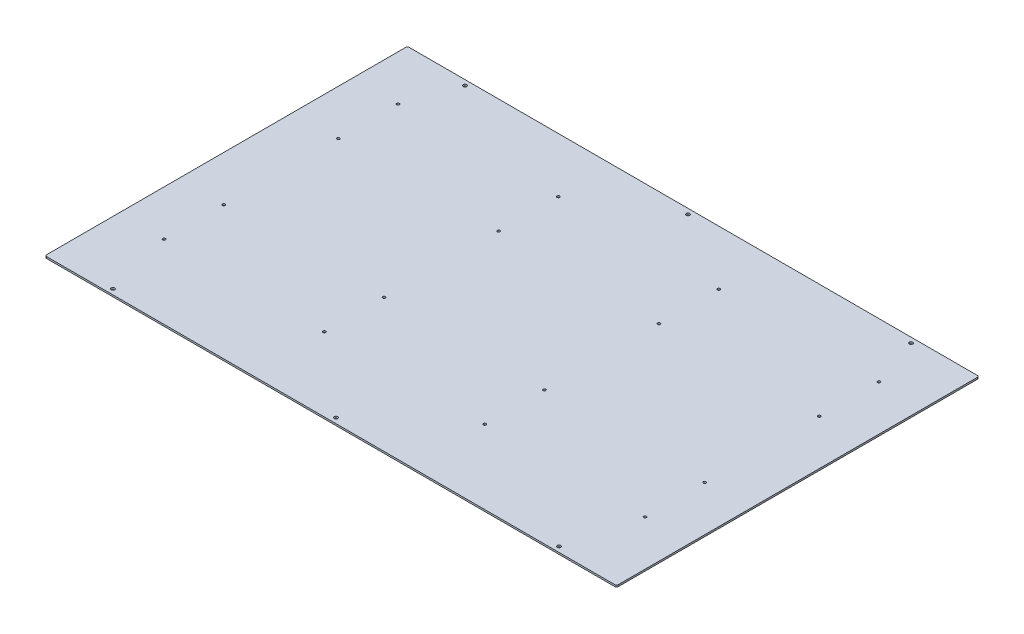
ISO-10303-21;
HEADER;
FILE_DESCRIPTION(('STEP AP214'),'2;1');
FILE_NAME('part.step','',(''),(''),'','','');
FILE_SCHEMA(('AUTOMOTIVE_DESIGN { 1 0 10303 214 1 1 1 1 }'));
ENDSEC;
DATA;
#1=APPLICATION_CONTEXT('core data for automotive mechanical design processes');
#2=APPLICATION_PROTOCOL_DEFINITION('international standard','automotive_design',2000,#1);
#3=PRODUCT_CONTEXT('',#1,'mechanical');
#4=PRODUCT('Part','Part','',(#3));
#5=PRODUCT_RELATED_PRODUCT_CATEGORY('part','',(#4));
#6=PRODUCT_DEFINITION_FORMATION('','',#4);
#7=PRODUCT_DEFINITION_CONTEXT('part definition',#1,'design');
#8=PRODUCT_DEFINITION('design','',#6,#7);
#9=PRODUCT_DEFINITION_SHAPE('','',#8);
#10=(LENGTH_UNIT() NAMED_UNIT(*) SI_UNIT(.MILLI.,.METRE.));
#11=(NAMED_UNIT(*) PLANE_ANGLE_UNIT() SI_UNIT($,.RADIAN.));
#12=(NAMED_UNIT(*) SI_UNIT($,.STERADIAN.) SOLID_ANGLE_UNIT());
#13=UNCERTAINTY_MEASURE_WITH_UNIT(LENGTH_MEASURE(1.E-05),#10,'distance_accuracy_value','');
#14=(GEOMETRIC_REPRESENTATION_CONTEXT(3) GLOBAL_UNCERTAINTY_ASSIGNED_CONTEXT((#13)) GLOBAL_UNIT_ASSIGNED_CONTEXT((#10,
#11,#12)) REPRESENTATION_CONTEXT('',''));
#15=CARTESIAN_POINT('',(0.,0.,0.));
#16=DIRECTION('',(0.,0.,1.));
#17=DIRECTION('',(1.,0.,0.));
#18=AXIS2_PLACEMENT_3D('',#15,#16,#17);
#19=CARTESIAN_POINT('',(-517.525,0.,327.025));
#20=DIRECTION('',(0.,-1.,0.));
#21=DIRECTION('',(0.,0.,-1.));
#22=AXIS2_PLACEMENT_3D('',#19,#20,#21);
#23=PLANE('',#22);
#24=CARTESIAN_POINT('',(-438.150000000001,0.,-230.468256121182));
#25=DIRECTION('',(0.,1.,0.));
#26=DIRECTION('',(0.,0.,1.));
#27=AXIS2_PLACEMENT_3D('',#24,#25,#26);
#28=CIRCLE('',#27,2.45744999999997);
#29=CARTESIAN_POINT('',(-438.150000000001,0.,-228.010806121182));
#30=VERTEX_POINT('',#29);
#31=EDGE_CURVE('E307',#30,#30,#28,.T.);
#32=ORIENTED_EDGE('',*,*,#31,.T.);
#33=EDGE_LOOP('',(#32));
#34=FACE_BOUND('',#33,.T.);
#35=CARTESIAN_POINT('',(-438.150000000001,0.,-121.756256121182));
#36=DIRECTION('',(0.,1.,0.));
#37=DIRECTION('',(0.,0.,1.));
#38=AXIS2_PLACEMENT_3D('',#35,#36,#37);
#39=CIRCLE('',#38,2.45744999999997);
#40=CARTESIAN_POINT('',(-438.150000000001,0.,-119.298806121182));
#41=VERTEX_POINT('',#40);
#42=EDGE_CURVE('E301',#41,#41,#39,.T.);
#43=ORIENTED_EDGE('',*,*,#42,.T.);
#44=EDGE_LOOP('',(#43));
#45=FACE_BOUND('',#44,.T.);
#46=CARTESIAN_POINT('',(-146.050000000002,0.,-121.756256121182));
#47=DIRECTION('',(0.,1.,0.));
#48=DIRECTION('',(0.,0.,1.));
#49=AXIS2_PLACEMENT_3D('',#46,#47,#48);
#50=CIRCLE('',#49,2.45745);
#51=CARTESIAN_POINT('',(-146.050000000002,0.,-119.298806121182));
#52=VERTEX_POINT('',#51);
#53=EDGE_CURVE('E295',#52,#52,#50,.T.);
#54=ORIENTED_EDGE('',*,*,#53,.T.);
#55=EDGE_LOOP('',(#54));
#56=FACE_BOUND('',#55,.T.);
#57=CARTESIAN_POINT('',(-517.525,0.,327.025));
#58=DIRECTION('',(0.,1.,0.));
#59=DIRECTION('',(0.,0.,-1.));
#60=AXIS2_PLACEMENT_3D('',#57,#58,#59);
#61=CIRCLE('',#60,3.17500000000001);
#62=CARTESIAN_POINT('',(-520.7,0.,327.025));
#63=VERTEX_POINT('',#62);
#64=CARTESIAN_POINT('',(-517.525,0.,330.2));
#65=VERTEX_POINT('',#64);
#66=EDGE_CURVE('E134',#63,#65,#61,.T.);
#67=ORIENTED_EDGE('',*,*,#66,.F.);
#68=DIRECTION('',(0.,0.,1.));
#69=VECTOR('',#68,1.);
#70=CARTESIAN_POINT('',(-520.7,0.,327.025));
#71=LINE('',#70,#69);
#72=CARTESIAN_POINT('',(-520.7,0.,-327.025));
#73=VERTEX_POINT('',#72);
#74=EDGE_CURVE('E88',#73,#63,#71,.T.);
#75=ORIENTED_EDGE('',*,*,#74,.F.);
#76=CARTESIAN_POINT('',(-517.525,0.,-327.025));
#77=DIRECTION('',(0.,1.,0.));
#78=DIRECTION('',(0.,0.,-1.));
#79=AXIS2_PLACEMENT_3D('',#76,#77,#78);
#80=CIRCLE('',#79,3.17500000000001);
#81=CARTESIAN_POINT('',(-517.525,0.,-330.2));
#82=VERTEX_POINT('',#81);
#83=EDGE_CURVE('E82',#82,#73,#80,.T.);
#84=ORIENTED_EDGE('',*,*,#83,.F.);
#85=DIRECTION('',(-1.,0.,0.));
#86=VECTOR('',#85,1.);
#87=CARTESIAN_POINT('',(-517.525,0.,-330.2));
#88=LINE('',#87,#86);
#89=CARTESIAN_POINT('',(517.525,0.,-330.2));
#90=VERTEX_POINT('',#89);
#91=EDGE_CURVE('E124',#90,#82,#88,.T.);
#92=ORIENTED_EDGE('',*,*,#91,.F.);
#93=CARTESIAN_POINT('',(517.525,0.,-327.025));
#94=DIRECTION('',(0.,1.,0.));
#95=DIRECTION('',(0.,0.,-1.));
#96=AXIS2_PLACEMENT_3D('',#93,#94,#95);
#97=CIRCLE('',#96,3.17500000000001);
#98=CARTESIAN_POINT('',(520.7,0.,-327.025));
#99=VERTEX_POINT('',#98);
#100=EDGE_CURVE('E144',#99,#90,#97,.T.);
#101=ORIENTED_EDGE('',*,*,#100,.F.);
#102=DIRECTION('',(0.,0.,-1.));
#103=VECTOR('',#102,1.);
#104=CARTESIAN_POINT('',(520.7,0.,327.025));
#105=LINE('',#104,#103);
#106=CARTESIAN_POINT('',(520.7,0.,327.025));
#107=VERTEX_POINT('',#106);
#108=EDGE_CURVE('E142',#107,#99,#105,.T.);
#109=ORIENTED_EDGE('',*,*,#108,.F.);
#110=CARTESIAN_POINT('',(517.525,0.,327.025));
#111=DIRECTION('',(0.,1.,0.));
#112=DIRECTION('',(0.,0.,1.));
#113=AXIS2_PLACEMENT_3D('',#110,#111,#112);
#114=CIRCLE('',#113,3.17500000000001);
#115=CARTESIAN_POINT('',(517.525,0.,330.2));
#116=VERTEX_POINT('',#115);
#117=EDGE_CURVE('E140',#116,#107,#114,.T.);
#118=ORIENTED_EDGE('',*,*,#117,.F.);
#119=DIRECTION('',(1.,0.,0.));
#120=VECTOR('',#119,1.);
#121=CARTESIAN_POINT('',(-517.525,0.,330.2));
#122=LINE('',#121,#120);
#123=EDGE_CURVE('E137',#65,#116,#122,.T.);
#124=ORIENTED_EDGE('',*,*,#123,.F.);
#125=EDGE_LOOP('',(#67,#75,#84,#92,#101,#109,#118,#124));
#126=FACE_BOUND('',#125,.T.);
#127=CARTESIAN_POINT('',(-406.4,0.,320.675));
#128=DIRECTION('',(0.,1.,0.));
#129=DIRECTION('',(0.,0.,1.));
#130=AXIS2_PLACEMENT_3D('',#127,#128,#129);
#131=CIRCLE('',#130,3.17499999999998);
#132=CARTESIAN_POINT('',(-406.4,0.,323.85));
#133=VERTEX_POINT('',#132);
#134=EDGE_CURVE('E138',#133,#133,#131,.T.);
#135=ORIENTED_EDGE('',*,*,#134,.T.);
#136=EDGE_LOOP('',(#135));
#137=FACE_BOUND('',#136,.T.);
#138=CARTESIAN_POINT('',(0.,0.,320.675));
#139=DIRECTION('',(0.,1.,0.));
#140=DIRECTION('',(0.,0.,1.));
#141=AXIS2_PLACEMENT_3D('',#138,#139,#140);
#142=CIRCLE('',#141,3.175);
#143=CARTESIAN_POINT('',(0.,0.,323.85));
#144=VERTEX_POINT('',#143);
#145=EDGE_CURVE('E187',#144,#144,#142,.T.);
#146=ORIENTED_EDGE('',*,*,#145,.T.);
#147=EDGE_LOOP('',(#146));
#148=FACE_BOUND('',#147,.T.);
#149=CARTESIAN_POINT('',(406.4,0.,320.675));
#150=DIRECTION('',(0.,1.,0.));
#151=DIRECTION('',(0.,0.,1.));
#152=AXIS2_PLACEMENT_3D('',#149,#150,#151);
#153=CIRCLE('',#152,3.17499999999998);
#154=CARTESIAN_POINT('',(406.4,0.,323.85));
#155=VERTEX_POINT('',#154);
#156=EDGE_CURVE('E193',#155,#155,#153,.T.);
#157=ORIENTED_EDGE('',*,*,#156,.T.);
#158=EDGE_LOOP('',(#157));
#159=FACE_BOUND('',#158,.T.);
#160=CARTESIAN_POINT('',(406.4,0.,-320.675));
#161=DIRECTION('',(0.,1.,0.));
#162=DIRECTION('',(0.,0.,1.));
#163=AXIS2_PLACEMENT_3D('',#160,#161,#162);
#164=CIRCLE('',#163,3.17499999999998);
#165=CARTESIAN_POINT('',(406.4,0.,-317.5));
#166=VERTEX_POINT('',#165);
#167=EDGE_CURVE('E199',#166,#166,#164,.T.);
#168=ORIENTED_EDGE('',*,*,#167,.T.);
#169=EDGE_LOOP('',(#168));
#170=FACE_BOUND('',#169,.T.);
#171=CARTESIAN_POINT('',(0.,0.,-320.675));
#172=DIRECTION('',(0.,1.,0.));
#173=DIRECTION('',(0.,0.,1.));
#174=AXIS2_PLACEMENT_3D('',#171,#172,#173);
#175=CIRCLE('',#174,3.175);
#176=CARTESIAN_POINT('',(0.,0.,-317.5));
#177=VERTEX_POINT('',#176);
#178=EDGE_CURVE('E205',#177,#177,#175,.T.);
#179=ORIENTED_EDGE('',*,*,#178,.T.);
#180=EDGE_LOOP('',(#179));
#181=FACE_BOUND('',#180,.T.);
#182=CARTESIAN_POINT('',(-406.4,0.,-320.675));
#183=DIRECTION('',(0.,1.,0.));
#184=DIRECTION('',(0.,0.,1.));
#185=AXIS2_PLACEMENT_3D('',#182,#183,#184);
#186=CIRCLE('',#185,3.17499999999998);
#187=CARTESIAN_POINT('',(-406.4,0.,-317.5));
#188=VERTEX_POINT('',#187);
#189=EDGE_CURVE('E211',#188,#188,#186,.T.);
#190=ORIENTED_EDGE('',*,*,#189,.T.);
#191=EDGE_LOOP('',(#190));
#192=FACE_BOUND('',#191,.T.);
#193=CARTESIAN_POINT('',(438.15,0.,195.743743878826));
#194=DIRECTION('',(0.,1.,0.));
#195=DIRECTION('',(0.,0.,1.));
#196=AXIS2_PLACEMENT_3D('',#193,#194,#195);
#197=CIRCLE('',#196,2.45744999999997);
#198=CARTESIAN_POINT('',(438.15,0.,198.201193878826));
#199=VERTEX_POINT('',#198);
#200=EDGE_CURVE('E217',#199,#199,#197,.T.);
#201=ORIENTED_EDGE('',*,*,#200,.T.);
#202=EDGE_LOOP('',(#201));
#203=FACE_BOUND('',#202,.T.);
#204=CARTESIAN_POINT('',(438.15,0.,87.0317438788256));
#205=DIRECTION('',(0.,1.,0.));
#206=DIRECTION('',(0.,0.,1.));
#207=AXIS2_PLACEMENT_3D('',#204,#205,#206);
#208=CIRCLE('',#207,2.45744999999997);
#209=CARTESIAN_POINT('',(438.15,0.,89.4891938788255));
#210=VERTEX_POINT('',#209);
#211=EDGE_CURVE('E223',#210,#210,#208,.T.);
#212=ORIENTED_EDGE('',*,*,#211,.T.);
#213=EDGE_LOOP('',(#212));
#214=FACE_BOUND('',#213,.T.);
#215=CARTESIAN_POINT('',(146.05,0.,195.743743878826));
#216=DIRECTION('',(0.,1.,0.));
#217=DIRECTION('',(0.,0.,1.));
#218=AXIS2_PLACEMENT_3D('',#215,#216,#217);
#219=CIRCLE('',#218,2.45745);
#220=CARTESIAN_POINT('',(146.05,0.,198.201193878826));
#221=VERTEX_POINT('',#220);
#222=EDGE_CURVE('E229',#221,#221,#219,.T.);
#223=ORIENTED_EDGE('',*,*,#222,.T.);
#224=EDGE_LOOP('',(#223));
#225=FACE_BOUND('',#224,.T.);
#226=CARTESIAN_POINT('',(146.05,0.,87.0317438788256));
#227=DIRECTION('',(0.,1.,0.));
#228=DIRECTION('',(0.,0.,1.));
#229=AXIS2_PLACEMENT_3D('',#226,#227,#228);
#230=CIRCLE('',#229,2.45745);
#231=CARTESIAN_POINT('',(146.05,0.,89.4891938788255));
#232=VERTEX_POINT('',#231);
#233=EDGE_CURVE('E235',#232,#232,#230,.T.);
#234=ORIENTED_EDGE('',*,*,#233,.T.);
#235=EDGE_LOOP('',(#234));
#236=FACE_BOUND('',#235,.T.);
#237=CARTESIAN_POINT('',(-146.05,0.,87.0317438788256));
#238=DIRECTION('',(0.,1.,0.));
#239=DIRECTION('',(0.,0.,1.));
#240=AXIS2_PLACEMENT_3D('',#237,#238,#239);
#241=CIRCLE('',#240,2.45745);
#242=CARTESIAN_POINT('',(-146.05,0.,89.4891938788256));
#243=VERTEX_POINT('',#242);
#244=EDGE_CURVE('E241',#243,#243,#241,.T.);
#245=ORIENTED_EDGE('',*,*,#244,.T.);
#246=EDGE_LOOP('',(#245));
#247=FACE_BOUND('',#246,.T.);
#248=CARTESIAN_POINT('',(-146.05,0.,195.743743878826));
#249=DIRECTION('',(0.,1.,0.));
#250=DIRECTION('',(0.,0.,1.));
#251=AXIS2_PLACEMENT_3D('',#248,#249,#250);
#252=CIRCLE('',#251,2.45745);
#253=CARTESIAN_POINT('',(-146.05,0.,198.201193878826));
#254=VERTEX_POINT('',#253);
#255=EDGE_CURVE('E247',#254,#254,#252,.T.);
#256=ORIENTED_EDGE('',*,*,#255,.T.);
#257=EDGE_LOOP('',(#256));
#258=FACE_BOUND('',#257,.T.);
#259=CARTESIAN_POINT('',(-438.15,0.,195.743743878826));
#260=DIRECTION('',(0.,1.,0.));
#261=DIRECTION('',(0.,0.,1.));
#262=AXIS2_PLACEMENT_3D('',#259,#260,#261);
#263=CIRCLE('',#262,2.45744999999997);
#264=CARTESIAN_POINT('',(-438.15,0.,198.201193878826));
#265=VERTEX_POINT('',#264);
#266=EDGE_CURVE('E253',#265,#265,#263,.T.);
#267=ORIENTED_EDGE('',*,*,#266,.T.);
#268=EDGE_LOOP('',(#267));
#269=FACE_BOUND('',#268,.T.);
#270=CARTESIAN_POINT('',(-438.15,0.,87.0317438788256));
#271=DIRECTION('',(0.,1.,0.));
#272=DIRECTION('',(0.,0.,1.));
#273=AXIS2_PLACEMENT_3D('',#270,#271,#272);
#274=CIRCLE('',#273,2.45744999999997);
#275=CARTESIAN_POINT('',(-438.15,0.,89.4891938788255));
#276=VERTEX_POINT('',#275);
#277=EDGE_CURVE('E259',#276,#276,#274,.T.);
#278=ORIENTED_EDGE('',*,*,#277,.T.);
#279=EDGE_LOOP('',(#278));
#280=FACE_BOUND('',#279,.T.);
#281=CARTESIAN_POINT('',(438.149999999998,0.,-121.756256121182));
#282=DIRECTION('',(0.,1.,0.));
#283=DIRECTION('',(0.,0.,1.));
#284=AXIS2_PLACEMENT_3D('',#281,#282,#283);
#285=CIRCLE('',#284,2.45744999999997);
#286=CARTESIAN_POINT('',(438.149999999998,0.,-119.298806121182));
#287=VERTEX_POINT('',#286);
#288=EDGE_CURVE('E265',#287,#287,#285,.T.);
#289=ORIENTED_EDGE('',*,*,#288,.T.);
#290=EDGE_LOOP('',(#289));
#291=FACE_BOUND('',#290,.T.);
#292=CARTESIAN_POINT('',(438.149999999998,0.,-230.468256121182));
#293=DIRECTION('',(0.,1.,0.));
#294=DIRECTION('',(0.,0.,1.));
#295=AXIS2_PLACEMENT_3D('',#292,#293,#294);
#296=CIRCLE('',#295,2.45744999999997);
#297=CARTESIAN_POINT('',(438.149999999998,0.,-228.010806121182));
#298=VERTEX_POINT('',#297);
#299=EDGE_CURVE('E271',#298,#298,#296,.T.);
#300=ORIENTED_EDGE('',*,*,#299,.T.);
#301=EDGE_LOOP('',(#300));
#302=FACE_BOUND('',#301,.T.);
#303=CARTESIAN_POINT('',(146.049999999998,0.,-230.468256121182));
#304=DIRECTION('',(0.,1.,0.));
#305=DIRECTION('',(0.,0.,1.));
#306=AXIS2_PLACEMENT_3D('',#303,#304,#305);
#307=CIRCLE('',#306,2.45745);
#308=CARTESIAN_POINT('',(146.049999999998,0.,-228.010806121182));
#309=VERTEX_POINT('',#308);
#310=EDGE_CURVE('E277',#309,#309,#307,.T.);
#311=ORIENTED_EDGE('',*,*,#310,.T.);
#312=EDGE_LOOP('',(#311));
#313=FACE_BOUND('',#312,.T.);
#314=CARTESIAN_POINT('',(146.049999999998,0.,-121.756256121182));
#315=DIRECTION('',(0.,1.,0.));
#316=DIRECTION('',(0.,0.,1.));
#317=AXIS2_PLACEMENT_3D('',#314,#315,#316);
#318=CIRCLE('',#317,2.45745);
#319=CARTESIAN_POINT('',(146.049999999998,0.,-119.298806121182));
#320=VERTEX_POINT('',#319);
#321=EDGE_CURVE('E283',#320,#320,#318,.T.);
#322=ORIENTED_EDGE('',*,*,#321,.T.);
#323=EDGE_LOOP('',(#322));
#324=FACE_BOUND('',#323,.T.);
#325=CARTESIAN_POINT('',(-146.050000000002,0.,-230.468256121182));
#326=DIRECTION('',(0.,1.,0.));
#327=DIRECTION('',(0.,0.,1.));
#328=AXIS2_PLACEMENT_3D('',#325,#326,#327);
#329=CIRCLE('',#328,2.45745);
#330=CARTESIAN_POINT('',(-146.050000000002,0.,-228.010806121182));
#331=VERTEX_POINT('',#330);
#332=EDGE_CURVE('E289',#331,#331,#329,.T.);
#333=ORIENTED_EDGE('',*,*,#332,.T.);
#334=EDGE_LOOP('',(#333));
#335=FACE_BOUND('',#334,.T.);
#336=ADVANCED_FACE('F36',(#34,#45,#56,#126,#137,#148,#159,#170,#181,#192,#203,#214,#225,#236,
#247,#258,#269,#280,#291,#302,#313,#324,#335),#23,.T.);
#337=CARTESIAN_POINT('',(-517.525,3.175,327.025));
#338=DIRECTION('',(0.,-1.,0.));
#339=DIRECTION('',(0.,0.,-1.));
#340=AXIS2_PLACEMENT_3D('',#337,#338,#339);
#341=PLANE('',#340);
#342=CARTESIAN_POINT('',(-438.150000000001,3.175,-230.468256121182));
#343=DIRECTION('',(0.,1.,0.));
#344=DIRECTION('',(0.,0.,1.));
#345=AXIS2_PLACEMENT_3D('',#342,#343,#344);
#346=CIRCLE('',#345,2.45744999999997);
#347=CARTESIAN_POINT('',(-438.150000000001,3.175,-228.010806121182));
#348=VERTEX_POINT('',#347);
#349=EDGE_CURVE('E310',#348,#348,#346,.T.);
#350=ORIENTED_EDGE('',*,*,#349,.F.);
#351=EDGE_LOOP('',(#350));
#352=FACE_BOUND('',#351,.T.);
#353=CARTESIAN_POINT('',(-438.150000000001,3.175,-121.756256121182));
#354=DIRECTION('',(0.,1.,0.));
#355=DIRECTION('',(0.,0.,1.));
#356=AXIS2_PLACEMENT_3D('',#353,#354,#355);
#357=CIRCLE('',#356,2.45744999999997);
#358=CARTESIAN_POINT('',(-438.150000000001,3.175,-119.298806121182));
#359=VERTEX_POINT('',#358);
#360=EDGE_CURVE('E304',#359,#359,#357,.T.);
#361=ORIENTED_EDGE('',*,*,#360,.F.);
#362=EDGE_LOOP('',(#361));
#363=FACE_BOUND('',#362,.T.);
#364=CARTESIAN_POINT('',(-146.050000000002,3.175,-121.756256121182));
#365=DIRECTION('',(0.,1.,0.));
#366=DIRECTION('',(0.,0.,1.));
#367=AXIS2_PLACEMENT_3D('',#364,#365,#366);
#368=CIRCLE('',#367,2.45745);
#369=CARTESIAN_POINT('',(-146.050000000002,3.175,-119.298806121182));
#370=VERTEX_POINT('',#369);
#371=EDGE_CURVE('E298',#370,#370,#368,.T.);
#372=ORIENTED_EDGE('',*,*,#371,.F.);
#373=EDGE_LOOP('',(#372));
#374=FACE_BOUND('',#373,.T.);
#375=CARTESIAN_POINT('',(-146.050000000002,3.175,-230.468256121182));
#376=DIRECTION('',(0.,1.,0.));
#377=DIRECTION('',(0.,0.,1.));
#378=AXIS2_PLACEMENT_3D('',#375,#376,#377);
#379=CIRCLE('',#378,2.45745);
#380=CARTESIAN_POINT('',(-146.050000000002,3.175,-228.010806121182));
#381=VERTEX_POINT('',#380);
#382=EDGE_CURVE('E292',#381,#381,#379,.T.);
#383=ORIENTED_EDGE('',*,*,#382,.F.);
#384=EDGE_LOOP('',(#383));
#385=FACE_BOUND('',#384,.T.);
#386=CARTESIAN_POINT('',(146.049999999998,3.175,-121.756256121182));
#387=DIRECTION('',(0.,1.,0.));
#388=DIRECTION('',(0.,0.,1.));
#389=AXIS2_PLACEMENT_3D('',#386,#387,#388);
#390=CIRCLE('',#389,2.45745);
#391=CARTESIAN_POINT('',(146.049999999998,3.175,-119.298806121182));
#392=VERTEX_POINT('',#391);
#393=EDGE_CURVE('E286',#392,#392,#390,.T.);
#394=ORIENTED_EDGE('',*,*,#393,.F.);
#395=EDGE_LOOP('',(#394));
#396=FACE_BOUND('',#395,.T.);
#397=CARTESIAN_POINT('',(146.049999999998,3.175,-230.468256121182));
#398=DIRECTION('',(0.,1.,0.));
#399=DIRECTION('',(0.,0.,1.));
#400=AXIS2_PLACEMENT_3D('',#397,#398,#399);
#401=CIRCLE('',#400,2.45745);
#402=CARTESIAN_POINT('',(146.049999999998,3.175,-228.010806121182));
#403=VERTEX_POINT('',#402);
#404=EDGE_CURVE('E280',#403,#403,#401,.T.);
#405=ORIENTED_EDGE('',*,*,#404,.F.);
#406=EDGE_LOOP('',(#405));
#407=FACE_BOUND('',#406,.T.);
#408=CARTESIAN_POINT('',(438.149999999998,3.175,-230.468256121182));
#409=DIRECTION('',(0.,1.,0.));
#410=DIRECTION('',(0.,0.,1.));
#411=AXIS2_PLACEMENT_3D('',#408,#409,#410);
#412=CIRCLE('',#411,2.45744999999997);
#413=CARTESIAN_POINT('',(438.149999999998,3.175,-228.010806121182));
#414=VERTEX_POINT('',#413);
#415=EDGE_CURVE('E274',#414,#414,#412,.T.);
#416=ORIENTED_EDGE('',*,*,#415,.F.);
#417=EDGE_LOOP('',(#416));
#418=FACE_BOUND('',#417,.T.);
#419=CARTESIAN_POINT('',(-438.15,3.175,87.0317438788256));
#420=DIRECTION('',(0.,1.,0.));
#421=DIRECTION('',(0.,0.,1.));
#422=AXIS2_PLACEMENT_3D('',#419,#420,#421);
#423=CIRCLE('',#422,2.45744999999997);
#424=CARTESIAN_POINT('',(-438.15,3.175,89.4891938788255));
#425=VERTEX_POINT('',#424);
#426=EDGE_CURVE('E262',#425,#425,#423,.T.);
#427=ORIENTED_EDGE('',*,*,#426,.F.);
#428=EDGE_LOOP('',(#427));
#429=FACE_BOUND('',#428,.T.);
#430=CARTESIAN_POINT('',(-438.15,3.175,195.743743878826));
#431=DIRECTION('',(0.,1.,0.));
#432=DIRECTION('',(0.,0.,1.));
#433=AXIS2_PLACEMENT_3D('',#430,#431,#432);
#434=CIRCLE('',#433,2.45744999999997);
#435=CARTESIAN_POINT('',(-438.15,3.175,198.201193878826));
#436=VERTEX_POINT('',#435);
#437=EDGE_CURVE('E256',#436,#436,#434,.T.);
#438=ORIENTED_EDGE('',*,*,#437,.F.);
#439=EDGE_LOOP('',(#438));
#440=FACE_BOUND('',#439,.T.);
#441=CARTESIAN_POINT('',(-146.05,3.175,195.743743878826));
#442=DIRECTION('',(0.,1.,0.));
#443=DIRECTION('',(0.,0.,1.));
#444=AXIS2_PLACEMENT_3D('',#441,#442,#443);
#445=CIRCLE('',#444,2.45745);
#446=CARTESIAN_POINT('',(-146.05,3.175,198.201193878826));
#447=VERTEX_POINT('',#446);
#448=EDGE_CURVE('E250',#447,#447,#445,.T.);
#449=ORIENTED_EDGE('',*,*,#448,.F.);
#450=EDGE_LOOP('',(#449));
#451=FACE_BOUND('',#450,.T.);
#452=CARTESIAN_POINT('',(-146.05,3.175,87.0317438788256));
#453=DIRECTION('',(0.,1.,0.));
#454=DIRECTION('',(0.,0.,1.));
#455=AXIS2_PLACEMENT_3D('',#452,#453,#454);
#456=CIRCLE('',#455,2.45745);
#457=CARTESIAN_POINT('',(-146.05,3.175,89.4891938788256));
#458=VERTEX_POINT('',#457);
#459=EDGE_CURVE('E244',#458,#458,#456,.T.);
#460=ORIENTED_EDGE('',*,*,#459,.F.);
#461=EDGE_LOOP('',(#460));
#462=FACE_BOUND('',#461,.T.);
#463=CARTESIAN_POINT('',(146.05,3.175,87.0317438788256));
#464=DIRECTION('',(0.,1.,0.));
#465=DIRECTION('',(0.,0.,1.));
#466=AXIS2_PLACEMENT_3D('',#463,#464,#465);
#467=CIRCLE('',#466,2.45745);
#468=CARTESIAN_POINT('',(146.05,3.175,89.4891938788255));
#469=VERTEX_POINT('',#468);
#470=EDGE_CURVE('E238',#469,#469,#467,.T.);
#471=ORIENTED_EDGE('',*,*,#470,.F.);
#472=EDGE_LOOP('',(#471));
#473=FACE_BOUND('',#472,.T.);
#474=CARTESIAN_POINT('',(146.05,3.175,195.743743878826));
#475=DIRECTION('',(0.,1.,0.));
#476=DIRECTION('',(0.,0.,1.));
#477=AXIS2_PLACEMENT_3D('',#474,#475,#476);
#478=CIRCLE('',#477,2.45745);
#479=CARTESIAN_POINT('',(146.05,3.175,198.201193878826));
#480=VERTEX_POINT('',#479);
#481=EDGE_CURVE('E232',#480,#480,#478,.T.);
#482=ORIENTED_EDGE('',*,*,#481,.F.);
#483=EDGE_LOOP('',(#482));
#484=FACE_BOUND('',#483,.T.);
#485=CARTESIAN_POINT('',(438.15,3.175,87.0317438788256));
#486=DIRECTION('',(0.,1.,0.));
#487=DIRECTION('',(0.,0.,1.));
#488=AXIS2_PLACEMENT_3D('',#485,#486,#487);
#489=CIRCLE('',#488,2.45744999999997);
#490=CARTESIAN_POINT('',(438.15,3.175,89.4891938788255));
#491=VERTEX_POINT('',#490);
#492=EDGE_CURVE('E226',#491,#491,#489,.T.);
#493=ORIENTED_EDGE('',*,*,#492,.F.);
#494=EDGE_LOOP('',(#493));
#495=FACE_BOUND('',#494,.T.);
#496=CARTESIAN_POINT('',(438.15,3.175,195.743743878826));
#497=DIRECTION('',(0.,1.,0.));
#498=DIRECTION('',(0.,0.,1.));
#499=AXIS2_PLACEMENT_3D('',#496,#497,#498);
#500=CIRCLE('',#499,2.45744999999997);
#501=CARTESIAN_POINT('',(438.15,3.175,198.201193878826));
#502=VERTEX_POINT('',#501);
#503=EDGE_CURVE('E220',#502,#502,#500,.T.);
#504=ORIENTED_EDGE('',*,*,#503,.F.);
#505=EDGE_LOOP('',(#504));
#506=FACE_BOUND('',#505,.T.);
#507=CARTESIAN_POINT('',(-406.4,3.175,-320.675));
#508=DIRECTION('',(0.,1.,0.));
#509=DIRECTION('',(0.,0.,1.));
#510=AXIS2_PLACEMENT_3D('',#507,#508,#509);
#511=CIRCLE('',#510,3.17499999999998);
#512=CARTESIAN_POINT('',(-406.4,3.175,-317.5));
#513=VERTEX_POINT('',#512);
#514=EDGE_CURVE('E214',#513,#513,#511,.T.);
#515=ORIENTED_EDGE('',*,*,#514,.F.);
#516=EDGE_LOOP('',(#515));
#517=FACE_BOUND('',#516,.T.);
#518=CARTESIAN_POINT('',(0.,3.175,-320.675));
#519=DIRECTION('',(0.,1.,0.));
#520=DIRECTION('',(0.,0.,1.));
#521=AXIS2_PLACEMENT_3D('',#518,#519,#520);
#522=CIRCLE('',#521,3.175);
#523=CARTESIAN_POINT('',(0.,3.175,-317.5));
#524=VERTEX_POINT('',#523);
#525=EDGE_CURVE('E208',#524,#524,#522,.T.);
#526=ORIENTED_EDGE('',*,*,#525,.F.);
#527=EDGE_LOOP('',(#526));
#528=FACE_BOUND('',#527,.T.);
#529=CARTESIAN_POINT('',(406.4,3.175,-320.675));
#530=DIRECTION('',(0.,1.,0.));
#531=DIRECTION('',(0.,0.,1.));
#532=AXIS2_PLACEMENT_3D('',#529,#530,#531);
#533=CIRCLE('',#532,3.17499999999998);
#534=CARTESIAN_POINT('',(406.4,3.175,-317.5));
#535=VERTEX_POINT('',#534);
#536=EDGE_CURVE('E202',#535,#535,#533,.T.);
#537=ORIENTED_EDGE('',*,*,#536,.F.);
#538=EDGE_LOOP('',(#537));
#539=FACE_BOUND('',#538,.T.);
#540=CARTESIAN_POINT('',(406.4,3.175,320.675));
#541=DIRECTION('',(0.,1.,0.));
#542=DIRECTION('',(0.,0.,1.));
#543=AXIS2_PLACEMENT_3D('',#540,#541,#542);
#544=CIRCLE('',#543,3.17499999999998);
#545=CARTESIAN_POINT('',(406.4,3.175,323.85));
#546=VERTEX_POINT('',#545);
#547=EDGE_CURVE('E196',#546,#546,#544,.T.);
#548=ORIENTED_EDGE('',*,*,#547,.F.);
#549=EDGE_LOOP('',(#548));
#550=FACE_BOUND('',#549,.T.);
#551=CARTESIAN_POINT('',(0.,3.175,320.675));
#552=DIRECTION('',(0.,1.,0.));
#553=DIRECTION('',(0.,0.,1.));
#554=AXIS2_PLACEMENT_3D('',#551,#552,#553);
#555=CIRCLE('',#554,3.175);
#556=CARTESIAN_POINT('',(0.,3.175,323.85));
#557=VERTEX_POINT('',#556);
#558=EDGE_CURVE('E190',#557,#557,#555,.T.);
#559=ORIENTED_EDGE('',*,*,#558,.F.);
#560=EDGE_LOOP('',(#559));
#561=FACE_BOUND('',#560,.T.);
#562=CARTESIAN_POINT('',(-406.4,3.175,320.675));
#563=DIRECTION('',(0.,1.,0.));
#564=DIRECTION('',(0.,0.,1.));
#565=AXIS2_PLACEMENT_3D('',#562,#563,#564);
#566=CIRCLE('',#565,3.17499999999998);
#567=CARTESIAN_POINT('',(-406.4,3.175,323.85));
#568=VERTEX_POINT('',#567);
#569=EDGE_CURVE('E184',#568,#568,#566,.T.);
#570=ORIENTED_EDGE('',*,*,#569,.F.);
#571=EDGE_LOOP('',(#570));
#572=FACE_BOUND('',#571,.T.);
#573=CARTESIAN_POINT('',(-517.525,3.175,327.025));
#574=DIRECTION('',(0.,1.,0.));
#575=DIRECTION('',(0.,0.,-1.));
#576=AXIS2_PLACEMENT_3D('',#573,#574,#575);
#577=CIRCLE('',#576,3.17500000000001);
#578=CARTESIAN_POINT('',(-520.7,3.175,327.025));
#579=VERTEX_POINT('',#578);
#580=CARTESIAN_POINT('',(-517.525,3.175,330.2));
#581=VERTEX_POINT('',#580);
#582=EDGE_CURVE('E149',#579,#581,#577,.T.);
#583=ORIENTED_EDGE('',*,*,#582,.T.);
#584=DIRECTION('',(1.,0.,0.));
#585=VECTOR('',#584,1.);
#586=CARTESIAN_POINT('',(-517.525,3.175,330.2));
#587=LINE('',#586,#585);
#588=CARTESIAN_POINT('',(517.525,3.175,330.2));
#589=VERTEX_POINT('',#588);
#590=EDGE_CURVE('E96',#581,#589,#587,.T.);
#591=ORIENTED_EDGE('',*,*,#590,.T.);
#592=CARTESIAN_POINT('',(517.525,3.175,327.025));
#593=DIRECTION('',(0.,1.,0.));
#594=DIRECTION('',(0.,0.,1.));
#595=AXIS2_PLACEMENT_3D('',#592,#593,#594);
#596=CIRCLE('',#595,3.17500000000001);
#597=CARTESIAN_POINT('',(520.7,3.175,327.025));
#598=VERTEX_POINT('',#597);
#599=EDGE_CURVE('E164',#589,#598,#596,.T.);
#600=ORIENTED_EDGE('',*,*,#599,.T.);
#601=DIRECTION('',(0.,0.,-1.));
#602=VECTOR('',#601,1.);
#603=CARTESIAN_POINT('',(520.7,3.175,327.025));
#604=LINE('',#603,#602);
#605=CARTESIAN_POINT('',(520.7,3.175,-327.025));
#606=VERTEX_POINT('',#605);
#607=EDGE_CURVE('E176',#598,#606,#604,.T.);
#608=ORIENTED_EDGE('',*,*,#607,.T.);
#609=CARTESIAN_POINT('',(517.525,3.175,-327.025));
#610=DIRECTION('',(0.,1.,0.));
#611=DIRECTION('',(0.,0.,-1.));
#612=AXIS2_PLACEMENT_3D('',#609,#610,#611);
#613=CIRCLE('',#612,3.17500000000001);
#614=CARTESIAN_POINT('',(517.525,3.175,-330.2));
#615=VERTEX_POINT('',#614);
#616=EDGE_CURVE('E116',#606,#615,#613,.T.);
#617=ORIENTED_EDGE('',*,*,#616,.T.);
#618=DIRECTION('',(-1.,0.,0.));
#619=VECTOR('',#618,1.);
#620=CARTESIAN_POINT('',(-517.525,3.175,-330.2));
#621=LINE('',#620,#619);
#622=CARTESIAN_POINT('',(-517.525,3.175,-330.2));
#623=VERTEX_POINT('',#622);
#624=EDGE_CURVE('E109',#615,#623,#621,.T.);
#625=ORIENTED_EDGE('',*,*,#624,.T.);
#626=CARTESIAN_POINT('',(-517.525,3.175,-327.025));
#627=DIRECTION('',(0.,1.,0.));
#628=DIRECTION('',(0.,0.,-1.));
#629=AXIS2_PLACEMENT_3D('',#626,#627,#628);
#630=CIRCLE('',#629,3.17500000000001);
#631=CARTESIAN_POINT('',(-520.7,3.175,-327.025));
#632=VERTEX_POINT('',#631);
#633=EDGE_CURVE('E114',#623,#632,#630,.T.);
#634=ORIENTED_EDGE('',*,*,#633,.T.);
#635=DIRECTION('',(0.,0.,1.));
#636=VECTOR('',#635,1.);
#637=CARTESIAN_POINT('',(-520.7,3.175,327.025));
#638=LINE('',#637,#636);
#639=EDGE_CURVE('E53',#632,#579,#638,.T.);
#640=ORIENTED_EDGE('',*,*,#639,.T.);
#641=EDGE_LOOP('',(#583,#591,#600,#608,#617,#625,#634,#640));
#642=FACE_BOUND('',#641,.T.);
#643=CARTESIAN_POINT('',(438.149999999998,3.175,-121.756256121182));
#644=DIRECTION('',(0.,1.,0.));
#645=DIRECTION('',(0.,0.,1.));
#646=AXIS2_PLACEMENT_3D('',#643,#644,#645);
#647=CIRCLE('',#646,2.45744999999997);
#648=CARTESIAN_POINT('',(438.149999999998,3.175,-119.298806121182));
#649=VERTEX_POINT('',#648);
#650=EDGE_CURVE('E268',#649,#649,#647,.T.);
#651=ORIENTED_EDGE('',*,*,#650,.F.);
#652=EDGE_LOOP('',(#651));
#653=FACE_BOUND('',#652,.T.);
#654=ADVANCED_FACE('F111',(#352,#363,#374,#385,#396,#407,#418,#429,#440,#451,#462,#473,#484,
#495,#506,#517,#528,#539,#550,#561,#572,#642,#653),#341,.F.);
#655=CARTESIAN_POINT('',(-517.525,3.175,327.025));
#656=DIRECTION('',(0.,-1.,0.));
#657=DIRECTION('',(0.,0.,-1.));
#658=AXIS2_PLACEMENT_3D('',#655,#656,#657);
#659=CYLINDRICAL_SURFACE('',#658,3.17500000000001);
#660=ORIENTED_EDGE('',*,*,#66,.T.);
#661=DIRECTION('',(0.,-1.,0.));
#662=VECTOR('',#661,1.);
#663=CARTESIAN_POINT('',(-517.525,3.175,330.2));
#664=LINE('',#663,#662);
#665=EDGE_CURVE('E11',#581,#65,#664,.T.);
#666=ORIENTED_EDGE('',*,*,#665,.F.);
#667=ORIENTED_EDGE('',*,*,#582,.F.);
#668=DIRECTION('',(0.,-1.,0.));
#669=VECTOR('',#668,1.);
#670=CARTESIAN_POINT('',(-520.7,3.175,327.025));
#671=LINE('',#670,#669);
#672=EDGE_CURVE('E130',#579,#63,#671,.T.);
#673=ORIENTED_EDGE('',*,*,#672,.T.);
#674=EDGE_LOOP('',(#660,#666,#667,#673));
#675=FACE_BOUND('',#674,.T.);
#676=ADVANCED_FACE('F38',(#675),#659,.T.);
#677=CARTESIAN_POINT('',(-517.525,3.175,330.2));
#678=DIRECTION('',(0.,0.,-1.));
#679=DIRECTION('',(-1.,0.,0.));
#680=AXIS2_PLACEMENT_3D('',#677,#678,#679);
#681=PLANE('',#680);
#682=ORIENTED_EDGE('',*,*,#123,.T.);
#683=DIRECTION('',(0.,-1.,0.));
#684=VECTOR('',#683,1.);
#685=CARTESIAN_POINT('',(517.525,3.175,330.2));
#686=LINE('',#685,#684);
#687=EDGE_CURVE('E45',#589,#116,#686,.T.);
#688=ORIENTED_EDGE('',*,*,#687,.F.);
#689=ORIENTED_EDGE('',*,*,#590,.F.);
#690=ORIENTED_EDGE('',*,*,#665,.T.);
#691=EDGE_LOOP('',(#682,#688,#689,#690));
#692=FACE_BOUND('',#691,.T.);
#693=ADVANCED_FACE('F390',(#692),#681,.F.);
#694=CARTESIAN_POINT('',(517.525,3.175,327.025));
#695=DIRECTION('',(0.,-1.,0.));
#696=DIRECTION('',(0.,0.,-1.));
#697=AXIS2_PLACEMENT_3D('',#694,#695,#696);
#698=CYLINDRICAL_SURFACE('',#697,3.17500000000001);
#699=ORIENTED_EDGE('',*,*,#117,.T.);
#700=DIRECTION('',(0.,-1.,0.));
#701=VECTOR('',#700,1.);
#702=CARTESIAN_POINT('',(520.7,3.175,327.025));
#703=LINE('',#702,#701);
#704=EDGE_CURVE('E156',#598,#107,#703,.T.);
#705=ORIENTED_EDGE('',*,*,#704,.F.);
#706=ORIENTED_EDGE('',*,*,#599,.F.);
#707=ORIENTED_EDGE('',*,*,#687,.T.);
#708=EDGE_LOOP('',(#699,#705,#706,#707));
#709=FACE_BOUND('',#708,.T.);
#710=ADVANCED_FACE('F162',(#709),#698,.T.);
#711=CARTESIAN_POINT('',(520.7,3.175,327.025));
#712=DIRECTION('',(-1.,0.,0.));
#713=DIRECTION('',(0.,0.,1.));
#714=AXIS2_PLACEMENT_3D('',#711,#712,#713);
#715=PLANE('',#714);
#716=ORIENTED_EDGE('',*,*,#108,.T.);
#717=DIRECTION('',(0.,-1.,0.));
#718=VECTOR('',#717,1.);
#719=CARTESIAN_POINT('',(520.7,3.175,-327.025));
#720=LINE('',#719,#718);
#721=EDGE_CURVE('E153',#606,#99,#720,.T.);
#722=ORIENTED_EDGE('',*,*,#721,.F.);
#723=ORIENTED_EDGE('',*,*,#607,.F.);
#724=ORIENTED_EDGE('',*,*,#704,.T.);
#725=EDGE_LOOP('',(#716,#722,#723,#724));
#726=FACE_BOUND('',#725,.T.);
#727=ADVANCED_FACE('F172',(#726),#715,.F.);
#728=CARTESIAN_POINT('',(517.525,3.175,-327.025));
#729=DIRECTION('',(0.,-1.,0.));
#730=DIRECTION('',(0.,0.,-1.));
#731=AXIS2_PLACEMENT_3D('',#728,#729,#730);
#732=CYLINDRICAL_SURFACE('',#731,3.17500000000001);
#733=ORIENTED_EDGE('',*,*,#100,.T.);
#734=DIRECTION('',(0.,-1.,0.));
#735=VECTOR('',#734,1.);
#736=CARTESIAN_POINT('',(517.525,3.175,-330.2));
#737=LINE('',#736,#735);
#738=EDGE_CURVE('E125',#615,#90,#737,.T.);
#739=ORIENTED_EDGE('',*,*,#738,.F.);
#740=ORIENTED_EDGE('',*,*,#616,.F.);
#741=ORIENTED_EDGE('',*,*,#721,.T.);
#742=EDGE_LOOP('',(#733,#739,#740,#741));
#743=FACE_BOUND('',#742,.T.);
#744=ADVANCED_FACE('F175',(#743),#732,.T.);
#745=CARTESIAN_POINT('',(-517.525,3.175,-330.2));
#746=DIRECTION('',(0.,0.,1.));
#747=DIRECTION('',(1.,0.,0.));
#748=AXIS2_PLACEMENT_3D('',#745,#746,#747);
#749=PLANE('',#748);
#750=ORIENTED_EDGE('',*,*,#91,.T.);
#751=DIRECTION('',(0.,-1.,0.));
#752=VECTOR('',#751,1.);
#753=CARTESIAN_POINT('',(-517.525,3.175,-330.2));
#754=LINE('',#753,#752);
#755=EDGE_CURVE('E121',#623,#82,#754,.T.);
#756=ORIENTED_EDGE('',*,*,#755,.F.);
#757=ORIENTED_EDGE('',*,*,#624,.F.);
#758=ORIENTED_EDGE('',*,*,#738,.T.);
#759=EDGE_LOOP('',(#750,#756,#757,#758));
#760=FACE_BOUND('',#759,.T.);
#761=ADVANCED_FACE('F122',(#760),#749,.F.);
#762=CARTESIAN_POINT('',(-517.525,3.175,-327.025));
#763=DIRECTION('',(0.,-1.,0.));
#764=DIRECTION('',(0.,0.,-1.));
#765=AXIS2_PLACEMENT_3D('',#762,#763,#764);
#766=CYLINDRICAL_SURFACE('',#765,3.17500000000001);
#767=ORIENTED_EDGE('',*,*,#83,.T.);
#768=DIRECTION('',(0.,-1.,0.));
#769=VECTOR('',#768,1.);
#770=CARTESIAN_POINT('',(-520.7,3.175,-327.025));
#771=LINE('',#770,#769);
#772=EDGE_CURVE('E126',#632,#73,#771,.T.);
#773=ORIENTED_EDGE('',*,*,#772,.F.);
#774=ORIENTED_EDGE('',*,*,#633,.F.);
#775=ORIENTED_EDGE('',*,*,#755,.T.);
#776=EDGE_LOOP('',(#767,#773,#774,#775));
#777=FACE_BOUND('',#776,.T.);
#778=ADVANCED_FACE('F128',(#777),#766,.T.);
#779=CARTESIAN_POINT('',(-520.7,3.175,327.025));
#780=DIRECTION('',(1.,0.,0.));
#781=DIRECTION('',(0.,0.,-1.));
#782=AXIS2_PLACEMENT_3D('',#779,#780,#781);
#783=PLANE('',#782);
#784=ORIENTED_EDGE('',*,*,#74,.T.);
#785=ORIENTED_EDGE('',*,*,#672,.F.);
#786=ORIENTED_EDGE('',*,*,#639,.F.);
#787=ORIENTED_EDGE('',*,*,#772,.T.);
#788=EDGE_LOOP('',(#784,#785,#786,#787));
#789=FACE_BOUND('',#788,.T.);
#790=ADVANCED_FACE('F362',(#789),#783,.F.);
#791=CARTESIAN_POINT('',(-406.4,3.175,320.675));
#792=DIRECTION('',(0.,1.,0.));
#793=DIRECTION('',(0.,0.,1.));
#794=AXIS2_PLACEMENT_3D('',#791,#792,#793);
#795=CYLINDRICAL_SURFACE('',#794,3.17499999999998);
#796=ORIENTED_EDGE('',*,*,#134,.F.);
#797=EDGE_LOOP('',(#796));
#798=FACE_BOUND('',#797,.T.);
#799=ORIENTED_EDGE('',*,*,#569,.T.);
#800=EDGE_LOOP('',(#799));
#801=FACE_BOUND('',#800,.T.);
#802=ADVANCED_FACE('F359',(#798,#801),#795,.F.);
#803=CARTESIAN_POINT('',(0.,3.175,320.675));
#804=DIRECTION('',(0.,1.,0.));
#805=DIRECTION('',(0.,0.,1.));
#806=AXIS2_PLACEMENT_3D('',#803,#804,#805);
#807=CYLINDRICAL_SURFACE('',#806,3.175);
#808=ORIENTED_EDGE('',*,*,#145,.F.);
#809=EDGE_LOOP('',(#808));
#810=FACE_BOUND('',#809,.T.);
#811=ORIENTED_EDGE('',*,*,#558,.T.);
#812=EDGE_LOOP('',(#811));
#813=FACE_BOUND('',#812,.T.);
#814=ADVANCED_FACE('F361',(#810,#813),#807,.F.);
#815=CARTESIAN_POINT('',(406.4,3.175,320.675));
#816=DIRECTION('',(0.,1.,0.));
#817=DIRECTION('',(0.,0.,1.));
#818=AXIS2_PLACEMENT_3D('',#815,#816,#817);
#819=CYLINDRICAL_SURFACE('',#818,3.17499999999998);
#820=ORIENTED_EDGE('',*,*,#156,.F.);
#821=EDGE_LOOP('',(#820));
#822=FACE_BOUND('',#821,.T.);
#823=ORIENTED_EDGE('',*,*,#547,.T.);
#824=EDGE_LOOP('',(#823));
#825=FACE_BOUND('',#824,.T.);
#826=ADVANCED_FACE('F369',(#822,#825),#819,.F.);
#827=CARTESIAN_POINT('',(406.4,3.175,-320.675));
#828=DIRECTION('',(0.,1.,0.));
#829=DIRECTION('',(0.,0.,1.));
#830=AXIS2_PLACEMENT_3D('',#827,#828,#829);
#831=CYLINDRICAL_SURFACE('',#830,3.17499999999998);
#832=ORIENTED_EDGE('',*,*,#167,.F.);
#833=EDGE_LOOP('',(#832));
#834=FACE_BOUND('',#833,.T.);
#835=ORIENTED_EDGE('',*,*,#536,.T.);
#836=EDGE_LOOP('',(#835));
#837=FACE_BOUND('',#836,.T.);
#838=ADVANCED_FACE('F627',(#834,#837),#831,.F.);
#839=CARTESIAN_POINT('',(0.,3.175,-320.675));
#840=DIRECTION('',(0.,1.,0.));
#841=DIRECTION('',(0.,0.,1.));
#842=AXIS2_PLACEMENT_3D('',#839,#840,#841);
#843=CYLINDRICAL_SURFACE('',#842,3.175);
#844=ORIENTED_EDGE('',*,*,#178,.F.);
#845=EDGE_LOOP('',(#844));
#846=FACE_BOUND('',#845,.T.);
#847=ORIENTED_EDGE('',*,*,#525,.T.);
#848=EDGE_LOOP('',(#847));
#849=FACE_BOUND('',#848,.T.);
#850=ADVANCED_FACE('F617',(#846,#849),#843,.F.);
#851=CARTESIAN_POINT('',(-406.4,3.175,-320.675));
#852=DIRECTION('',(0.,1.,0.));
#853=DIRECTION('',(0.,0.,1.));
#854=AXIS2_PLACEMENT_3D('',#851,#852,#853);
#855=CYLINDRICAL_SURFACE('',#854,3.17499999999998);
#856=ORIENTED_EDGE('',*,*,#189,.F.);
#857=EDGE_LOOP('',(#856));
#858=FACE_BOUND('',#857,.T.);
#859=ORIENTED_EDGE('',*,*,#514,.T.);
#860=EDGE_LOOP('',(#859));
#861=FACE_BOUND('',#860,.T.);
#862=ADVANCED_FACE('F502',(#858,#861),#855,.F.);
#863=CARTESIAN_POINT('',(438.15,3.175,195.743743878826));
#864=DIRECTION('',(0.,1.,0.));
#865=DIRECTION('',(0.,0.,1.));
#866=AXIS2_PLACEMENT_3D('',#863,#864,#865);
#867=CYLINDRICAL_SURFACE('',#866,2.45744999999997);
#868=ORIENTED_EDGE('',*,*,#200,.F.);
#869=EDGE_LOOP('',(#868));
#870=FACE_BOUND('',#869,.T.);
#871=ORIENTED_EDGE('',*,*,#503,.T.);
#872=EDGE_LOOP('',(#871));
#873=FACE_BOUND('',#872,.T.);
#874=ADVANCED_FACE('F497',(#870,#873),#867,.F.);
#875=CARTESIAN_POINT('',(438.15,3.175,87.0317438788256));
#876=DIRECTION('',(0.,1.,0.));
#877=DIRECTION('',(0.,0.,1.));
#878=AXIS2_PLACEMENT_3D('',#875,#876,#877);
#879=CYLINDRICAL_SURFACE('',#878,2.45744999999997);
#880=ORIENTED_EDGE('',*,*,#211,.F.);
#881=EDGE_LOOP('',(#880));
#882=FACE_BOUND('',#881,.T.);
#883=ORIENTED_EDGE('',*,*,#492,.T.);
#884=EDGE_LOOP('',(#883));
#885=FACE_BOUND('',#884,.T.);
#886=ADVANCED_FACE('F501',(#882,#885),#879,.F.);
#887=CARTESIAN_POINT('',(146.05,3.175,195.743743878826));
#888=DIRECTION('',(0.,1.,0.));
#889=DIRECTION('',(0.,0.,1.));
#890=AXIS2_PLACEMENT_3D('',#887,#888,#889);
#891=CYLINDRICAL_SURFACE('',#890,2.45745);
#892=ORIENTED_EDGE('',*,*,#222,.F.);
#893=EDGE_LOOP('',(#892));
#894=FACE_BOUND('',#893,.T.);
#895=ORIENTED_EDGE('',*,*,#481,.T.);
#896=EDGE_LOOP('',(#895));
#897=FACE_BOUND('',#896,.T.);
#898=ADVANCED_FACE('F513',(#894,#897),#891,.F.);
#899=CARTESIAN_POINT('',(146.05,3.175,87.0317438788256));
#900=DIRECTION('',(0.,1.,0.));
#901=DIRECTION('',(0.,0.,1.));
#902=AXIS2_PLACEMENT_3D('',#899,#900,#901);
#903=CYLINDRICAL_SURFACE('',#902,2.45745);
#904=ORIENTED_EDGE('',*,*,#233,.F.);
#905=EDGE_LOOP('',(#904));
#906=FACE_BOUND('',#905,.T.);
#907=ORIENTED_EDGE('',*,*,#470,.T.);
#908=EDGE_LOOP('',(#907));
#909=FACE_BOUND('',#908,.T.);
#910=ADVANCED_FACE('F523',(#906,#909),#903,.F.);
#911=CARTESIAN_POINT('',(-146.05,3.175,87.0317438788256));
#912=DIRECTION('',(0.,1.,0.));
#913=DIRECTION('',(0.,0.,1.));
#914=AXIS2_PLACEMENT_3D('',#911,#912,#913);
#915=CYLINDRICAL_SURFACE('',#914,2.45745);
#916=ORIENTED_EDGE('',*,*,#244,.F.);
#917=EDGE_LOOP('',(#916));
#918=FACE_BOUND('',#917,.T.);
#919=ORIENTED_EDGE('',*,*,#459,.T.);
#920=EDGE_LOOP('',(#919));
#921=FACE_BOUND('',#920,.T.);
#922=ADVANCED_FACE('F533',(#918,#921),#915,.F.);
#923=CARTESIAN_POINT('',(-146.05,3.175,195.743743878826));
#924=DIRECTION('',(0.,1.,0.));
#925=DIRECTION('',(0.,0.,1.));
#926=AXIS2_PLACEMENT_3D('',#923,#924,#925);
#927=CYLINDRICAL_SURFACE('',#926,2.45745);
#928=ORIENTED_EDGE('',*,*,#255,.F.);
#929=EDGE_LOOP('',(#928));
#930=FACE_BOUND('',#929,.T.);
#931=ORIENTED_EDGE('',*,*,#448,.T.);
#932=EDGE_LOOP('',(#931));
#933=FACE_BOUND('',#932,.T.);
#934=ADVANCED_FACE('F553',(#930,#933),#927,.F.);
#935=CARTESIAN_POINT('',(-438.15,3.175,195.743743878826));
#936=DIRECTION('',(0.,1.,0.));
#937=DIRECTION('',(0.,0.,1.));
#938=AXIS2_PLACEMENT_3D('',#935,#936,#937);
#939=CYLINDRICAL_SURFACE('',#938,2.45744999999997);
#940=ORIENTED_EDGE('',*,*,#266,.F.);
#941=EDGE_LOOP('',(#940));
#942=FACE_BOUND('',#941,.T.);
#943=ORIENTED_EDGE('',*,*,#437,.T.);
#944=EDGE_LOOP('',(#943));
#945=FACE_BOUND('',#944,.T.);
#946=ADVANCED_FACE('F543',(#942,#945),#939,.F.);
#947=CARTESIAN_POINT('',(-438.15,3.175,87.0317438788256));
#948=DIRECTION('',(0.,1.,0.));
#949=DIRECTION('',(0.,0.,1.));
#950=AXIS2_PLACEMENT_3D('',#947,#948,#949);
#951=CYLINDRICAL_SURFACE('',#950,2.45744999999997);
#952=ORIENTED_EDGE('',*,*,#277,.F.);
#953=EDGE_LOOP('',(#952));
#954=FACE_BOUND('',#953,.T.);
#955=ORIENTED_EDGE('',*,*,#426,.T.);
#956=EDGE_LOOP('',(#955));
#957=FACE_BOUND('',#956,.T.);
#958=ADVANCED_FACE('F445',(#954,#957),#951,.F.);
#959=CARTESIAN_POINT('',(438.149999999998,3.175,-121.756256121182));
#960=DIRECTION('',(0.,1.,0.));
#961=DIRECTION('',(0.,0.,1.));
#962=AXIS2_PLACEMENT_3D('',#959,#960,#961);
#963=CYLINDRICAL_SURFACE('',#962,2.45744999999997);
#964=ORIENTED_EDGE('',*,*,#288,.F.);
#965=EDGE_LOOP('',(#964));
#966=FACE_BOUND('',#965,.T.);
#967=ORIENTED_EDGE('',*,*,#650,.T.);
#968=EDGE_LOOP('',(#967));
#969=FACE_BOUND('',#968,.T.);
#970=ADVANCED_FACE('F421',(#966,#969),#963,.F.);
#971=CARTESIAN_POINT('',(438.149999999998,3.175,-230.468256121182));
#972=DIRECTION('',(0.,1.,0.));
#973=DIRECTION('',(0.,0.,1.));
#974=AXIS2_PLACEMENT_3D('',#971,#972,#973);
#975=CYLINDRICAL_SURFACE('',#974,2.45744999999997);
#976=ORIENTED_EDGE('',*,*,#299,.F.);
#977=EDGE_LOOP('',(#976));
#978=FACE_BOUND('',#977,.T.);
#979=ORIENTED_EDGE('',*,*,#415,.T.);
#980=EDGE_LOOP('',(#979));
#981=FACE_BOUND('',#980,.T.);
#982=ADVANCED_FACE('F415',(#978,#981),#975,.F.);
#983=CARTESIAN_POINT('',(146.049999999998,3.175,-230.468256121182));
#984=DIRECTION('',(0.,1.,0.));
#985=DIRECTION('',(0.,0.,1.));
#986=AXIS2_PLACEMENT_3D('',#983,#984,#985);
#987=CYLINDRICAL_SURFACE('',#986,2.45745);
#988=ORIENTED_EDGE('',*,*,#310,.F.);
#989=EDGE_LOOP('',(#988));
#990=FACE_BOUND('',#989,.T.);
#991=ORIENTED_EDGE('',*,*,#404,.T.);
#992=EDGE_LOOP('',(#991));
#993=FACE_BOUND('',#992,.T.);
#994=ADVANCED_FACE('F420',(#990,#993),#987,.F.);
#995=CARTESIAN_POINT('',(146.049999999998,3.175,-121.756256121182));
#996=DIRECTION('',(0.,1.,0.));
#997=DIRECTION('',(0.,0.,1.));
#998=AXIS2_PLACEMENT_3D('',#995,#996,#997);
#999=CYLINDRICAL_SURFACE('',#998,2.45745);
#1000=ORIENTED_EDGE('',*,*,#321,.F.);
#1001=EDGE_LOOP('',(#1000));
#1002=FACE_BOUND('',#1001,.T.);
#1003=ORIENTED_EDGE('',*,*,#393,.T.);
#1004=EDGE_LOOP('',(#1003));
#1005=FACE_BOUND('',#1004,.T.);
#1006=ADVANCED_FACE('F463',(#1002,#1005),#999,.F.);
#1007=CARTESIAN_POINT('',(-146.050000000002,3.175,-230.468256121182));
#1008=DIRECTION('',(0.,1.,0.));
#1009=DIRECTION('',(0.,0.,1.));
#1010=AXIS2_PLACEMENT_3D('',#1007,#1008,#1009);
#1011=CYLINDRICAL_SURFACE('',#1010,2.45745);
#1012=ORIENTED_EDGE('',*,*,#332,.F.);
#1013=EDGE_LOOP('',(#1012));
#1014=FACE_BOUND('',#1013,.T.);
#1015=ORIENTED_EDGE('',*,*,#382,.T.);
#1016=EDGE_LOOP('',(#1015));
#1017=FACE_BOUND('',#1016,.T.);
#1018=ADVANCED_FACE('F468',(#1014,#1017),#1011,.F.);
#1019=CARTESIAN_POINT('',(-146.050000000002,3.175,-121.756256121182));
#1020=DIRECTION('',(0.,1.,0.));
#1021=DIRECTION('',(0.,0.,1.));
#1022=AXIS2_PLACEMENT_3D('',#1019,#1020,#1021);
#1023=CYLINDRICAL_SURFACE('',#1022,2.45745);
#1024=ORIENTED_EDGE('',*,*,#53,.F.);
#1025=EDGE_LOOP('',(#1024));
#1026=FACE_BOUND('',#1025,.T.);
#1027=ORIENTED_EDGE('',*,*,#371,.T.);
#1028=EDGE_LOOP('',(#1027));
#1029=FACE_BOUND('',#1028,.T.);
#1030=ADVANCED_FACE('F455',(#1026,#1029),#1023,.F.);
#1031=CARTESIAN_POINT('',(-438.150000000001,3.175,-121.756256121182));
#1032=DIRECTION('',(0.,1.,0.));
#1033=DIRECTION('',(0.,0.,1.));
#1034=AXIS2_PLACEMENT_3D('',#1031,#1032,#1033);
#1035=CYLINDRICAL_SURFACE('',#1034,2.45744999999997);
#1036=ORIENTED_EDGE('',*,*,#42,.F.);
#1037=EDGE_LOOP('',(#1036));
#1038=FACE_BOUND('',#1037,.T.);
#1039=ORIENTED_EDGE('',*,*,#360,.T.);
#1040=EDGE_LOOP('',(#1039));
#1041=FACE_BOUND('',#1040,.T.);
#1042=ADVANCED_FACE('F435',(#1038,#1041),#1035,.F.);
#1043=CARTESIAN_POINT('',(-438.150000000001,3.175,-230.468256121182));
#1044=DIRECTION('',(0.,1.,0.));
#1045=DIRECTION('',(0.,0.,1.));
#1046=AXIS2_PLACEMENT_3D('',#1043,#1044,#1045);
#1047=CYLINDRICAL_SURFACE('',#1046,2.45744999999997);
#1048=ORIENTED_EDGE('',*,*,#31,.F.);
#1049=EDGE_LOOP('',(#1048));
#1050=FACE_BOUND('',#1049,.T.);
#1051=ORIENTED_EDGE('',*,*,#349,.T.);
#1052=EDGE_LOOP('',(#1051));
#1053=FACE_BOUND('',#1052,.T.);
#1054=ADVANCED_FACE('F314',(#1050,#1053),#1047,.F.);
#1055=CLOSED_SHELL('',(#336,#654,#676,#693,#710,#727,#744,#761,#778,#790,#802,#814,#826,#838,
#850,#862,#874,#886,#898,#910,#922,#934,#946,#958,#970,#982,#994,#1006,#1018,#1030,#1042,#1054));
#1056=MANIFOLD_SOLID_BREP('B2',#1055);
#1057=ADVANCED_BREP_SHAPE_REPRESENTATION('',(#18,#1056),#14);
#1058=SHAPE_DEFINITION_REPRESENTATION(#9,#1057);
ENDSEC;
END-ISO-10303-21;
